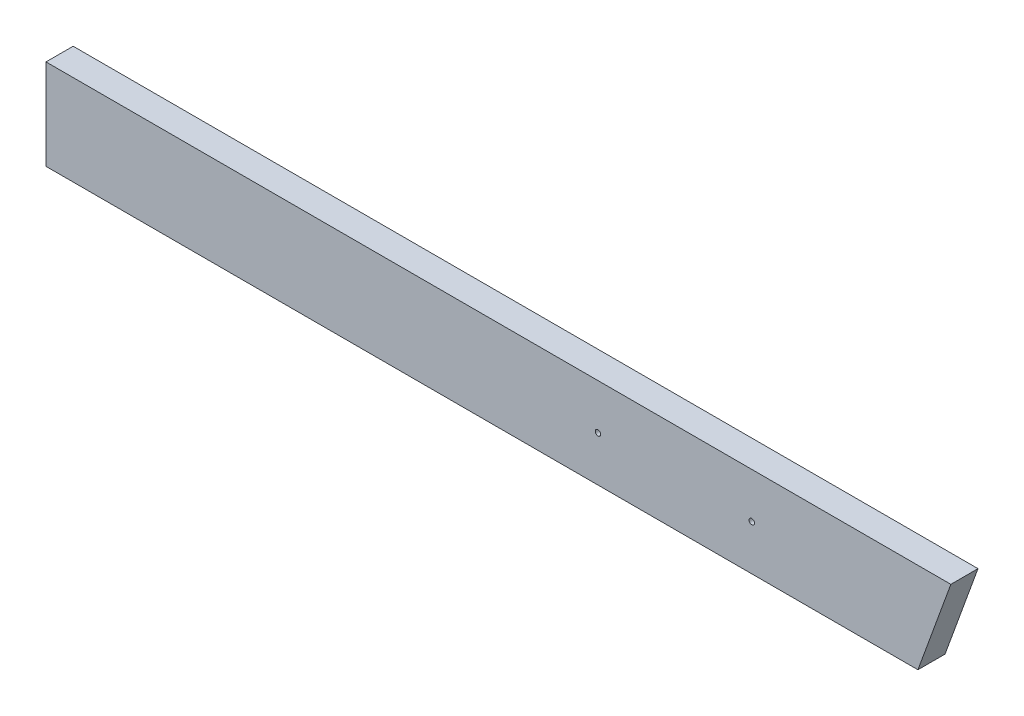
ISO-10303-21;
HEADER;
FILE_DESCRIPTION(('STEP AP214'),'2;1');
FILE_NAME('part.step','',(''),(''),'','','');
FILE_SCHEMA(('AUTOMOTIVE_DESIGN { 1 0 10303 214 1 1 1 1 }'));
ENDSEC;
DATA;
#1=APPLICATION_CONTEXT('core data for automotive mechanical design processes');
#2=APPLICATION_PROTOCOL_DEFINITION('international standard','automotive_design',2000,#1);
#3=PRODUCT_CONTEXT('',#1,'mechanical');
#4=PRODUCT('Part','Part','',(#3));
#5=PRODUCT_RELATED_PRODUCT_CATEGORY('part','',(#4));
#6=PRODUCT_DEFINITION_FORMATION('','',#4);
#7=PRODUCT_DEFINITION_CONTEXT('part definition',#1,'design');
#8=PRODUCT_DEFINITION('design','',#6,#7);
#9=PRODUCT_DEFINITION_SHAPE('','',#8);
#10=(LENGTH_UNIT() NAMED_UNIT(*) SI_UNIT(.MILLI.,.METRE.));
#11=(NAMED_UNIT(*) PLANE_ANGLE_UNIT() SI_UNIT($,.RADIAN.));
#12=(NAMED_UNIT(*) SI_UNIT($,.STERADIAN.) SOLID_ANGLE_UNIT());
#13=UNCERTAINTY_MEASURE_WITH_UNIT(LENGTH_MEASURE(1.E-05),#10,'distance_accuracy_value','');
#14=(GEOMETRIC_REPRESENTATION_CONTEXT(3) GLOBAL_UNCERTAINTY_ASSIGNED_CONTEXT((#13)) GLOBAL_UNIT_ASSIGNED_CONTEXT((#10,
#11,#12)) REPRESENTATION_CONTEXT('',''));
#15=CARTESIAN_POINT('',(0.,0.,0.));
#16=DIRECTION('',(0.,0.,1.));
#17=DIRECTION('',(1.,0.,0.));
#18=AXIS2_PLACEMENT_3D('',#15,#16,#17);
#19=CARTESIAN_POINT('',(-500.,50.,30.));
#20=DIRECTION('',(1.,0.,0.));
#21=DIRECTION('',(0.,0.,-1.));
#22=AXIS2_PLACEMENT_3D('',#19,#20,#21);
#23=PLANE('',#22);
#24=DIRECTION('',(0.,-1.,0.));
#25=VECTOR('',#24,1.);
#26=CARTESIAN_POINT('',(-500.,50.,0.));
#27=LINE('',#26,#25);
#28=CARTESIAN_POINT('',(-500.,50.,0.));
#29=VERTEX_POINT('',#28);
#30=CARTESIAN_POINT('',(-500.,-50.,0.));
#31=VERTEX_POINT('',#30);
#32=EDGE_CURVE('E107',#29,#31,#27,.T.);
#33=ORIENTED_EDGE('',*,*,#32,.T.);
#34=DIRECTION('',(0.,0.,-1.));
#35=VECTOR('',#34,1.);
#36=CARTESIAN_POINT('',(-500.,-50.,30.));
#37=LINE('',#36,#35);
#38=CARTESIAN_POINT('',(-500.,-50.,30.));
#39=VERTEX_POINT('',#38);
#40=EDGE_CURVE('E11',#39,#31,#37,.T.);
#41=ORIENTED_EDGE('',*,*,#40,.F.);
#42=DIRECTION('',(0.,-1.,0.));
#43=VECTOR('',#42,1.);
#44=CARTESIAN_POINT('',(-500.,50.,30.));
#45=LINE('',#44,#43);
#46=CARTESIAN_POINT('',(-500.,50.,30.));
#47=VERTEX_POINT('',#46);
#48=EDGE_CURVE('E91',#47,#39,#45,.T.);
#49=ORIENTED_EDGE('',*,*,#48,.F.);
#50=DIRECTION('',(0.,0.,-1.));
#51=VECTOR('',#50,1.);
#52=CARTESIAN_POINT('',(-500.,50.,30.));
#53=LINE('',#52,#51);
#54=EDGE_CURVE('E103',#47,#29,#53,.T.);
#55=ORIENTED_EDGE('',*,*,#54,.T.);
#56=EDGE_LOOP('',(#33,#41,#49,#55));
#57=FACE_BOUND('',#56,.T.);
#58=ADVANCED_FACE('F39',(#57),#23,.F.);
#59=CARTESIAN_POINT('',(463.60297657338,-50.,30.));
#60=DIRECTION('',(0.,1.,0.));
#61=DIRECTION('',(-1.,0.,0.));
#62=AXIS2_PLACEMENT_3D('',#59,#60,#61);
#63=PLANE('',#62);
#64=DIRECTION('',(1.,0.,0.));
#65=VECTOR('',#64,1.);
#66=CARTESIAN_POINT('',(463.60297657338,-50.,0.));
#67=LINE('',#66,#65);
#68=CARTESIAN_POINT('',(463.60297657338,-50.,0.));
#69=VERTEX_POINT('',#68);
#70=EDGE_CURVE('E96',#31,#69,#67,.T.);
#71=ORIENTED_EDGE('',*,*,#70,.T.);
#72=DIRECTION('',(0.,0.,-1.));
#73=VECTOR('',#72,1.);
#74=CARTESIAN_POINT('',(463.60297657338,-50.,30.));
#75=LINE('',#74,#73);
#76=CARTESIAN_POINT('',(463.60297657338,-50.,30.));
#77=VERTEX_POINT('',#76);
#78=EDGE_CURVE('E48',#77,#69,#75,.T.);
#79=ORIENTED_EDGE('',*,*,#78,.F.);
#80=DIRECTION('',(1.,0.,0.));
#81=VECTOR('',#80,1.);
#82=CARTESIAN_POINT('',(463.60297657338,-50.,30.));
#83=LINE('',#82,#81);
#84=EDGE_CURVE('E86',#39,#77,#83,.T.);
#85=ORIENTED_EDGE('',*,*,#84,.F.);
#86=ORIENTED_EDGE('',*,*,#40,.T.);
#87=EDGE_LOOP('',(#71,#79,#85,#86));
#88=FACE_BOUND('',#87,.T.);
#89=ADVANCED_FACE('F95',(#88),#63,.F.);
#90=CARTESIAN_POINT('',(500.,50.,30.));
#91=DIRECTION('',(-0.939692620785907,0.342020143325673,0.));
#92=DIRECTION('',(-0.342020143325673,-0.939692620785907,0.));
#93=AXIS2_PLACEMENT_3D('',#90,#91,#92);
#94=PLANE('',#93);
#95=DIRECTION('',(0.342020143325673,0.939692620785907,0.));
#96=VECTOR('',#95,1.);
#97=CARTESIAN_POINT('',(500.,50.,0.));
#98=LINE('',#97,#96);
#99=CARTESIAN_POINT('',(500.,50.,0.));
#100=VERTEX_POINT('',#99);
#101=EDGE_CURVE('E73',#69,#100,#98,.T.);
#102=ORIENTED_EDGE('',*,*,#101,.T.);
#103=DIRECTION('',(0.,0.,-1.));
#104=VECTOR('',#103,1.);
#105=CARTESIAN_POINT('',(500.,50.,30.));
#106=LINE('',#105,#104);
#107=CARTESIAN_POINT('',(500.,50.,30.));
#108=VERTEX_POINT('',#107);
#109=EDGE_CURVE('E98',#108,#100,#106,.T.);
#110=ORIENTED_EDGE('',*,*,#109,.F.);
#111=DIRECTION('',(0.342020143325673,0.939692620785907,0.));
#112=VECTOR('',#111,1.);
#113=CARTESIAN_POINT('',(500.,50.,30.));
#114=LINE('',#113,#112);
#115=EDGE_CURVE('E89',#77,#108,#114,.T.);
#116=ORIENTED_EDGE('',*,*,#115,.F.);
#117=ORIENTED_EDGE('',*,*,#78,.T.);
#118=EDGE_LOOP('',(#102,#110,#116,#117));
#119=FACE_BOUND('',#118,.T.);
#120=ADVANCED_FACE('F99',(#119),#94,.F.);
#121=CARTESIAN_POINT('',(-500.,50.,30.));
#122=DIRECTION('',(0.,-1.,0.));
#123=DIRECTION('',(0.,0.,-1.));
#124=AXIS2_PLACEMENT_3D('',#121,#122,#123);
#125=PLANE('',#124);
#126=DIRECTION('',(-1.,0.,0.));
#127=VECTOR('',#126,1.);
#128=CARTESIAN_POINT('',(-500.,50.,0.));
#129=LINE('',#128,#127);
#130=EDGE_CURVE('E79',#100,#29,#129,.T.);
#131=ORIENTED_EDGE('',*,*,#130,.T.);
#132=ORIENTED_EDGE('',*,*,#54,.F.);
#133=DIRECTION('',(-1.,0.,0.));
#134=VECTOR('',#133,1.);
#135=CARTESIAN_POINT('',(-500.,50.,30.));
#136=LINE('',#135,#134);
#137=EDGE_CURVE('E56',#108,#47,#136,.T.);
#138=ORIENTED_EDGE('',*,*,#137,.F.);
#139=ORIENTED_EDGE('',*,*,#109,.T.);
#140=EDGE_LOOP('',(#131,#132,#138,#139));
#141=FACE_BOUND('',#140,.T.);
#142=ADVANCED_FACE('F121',(#141),#125,.F.);
#143=CARTESIAN_POINT('',(0.,0.,30.));
#144=DIRECTION('',(0.,0.,-1.));
#145=DIRECTION('',(-1.,0.,0.));
#146=AXIS2_PLACEMENT_3D('',#143,#144,#145);
#147=PLANE('',#146);
#148=CARTESIAN_POINT('',(110.,0.,30.));
#149=DIRECTION('',(0.,0.,1.));
#150=DIRECTION('',(1.,0.,0.));
#151=AXIS2_PLACEMENT_3D('',#148,#149,#150);
#152=CIRCLE('',#151,2.99999999999999);
#153=CARTESIAN_POINT('',(113.,0.,30.));
#154=VERTEX_POINT('',#153);
#155=EDGE_CURVE('E136',#154,#154,#152,.T.);
#156=ORIENTED_EDGE('',*,*,#155,.F.);
#157=EDGE_LOOP('',(#156));
#158=FACE_BOUND('',#157,.T.);
#159=CARTESIAN_POINT('',(280.,0.,30.));
#160=DIRECTION('',(0.,0.,1.));
#161=DIRECTION('',(1.,0.,0.));
#162=AXIS2_PLACEMENT_3D('',#159,#160,#161);
#163=CIRCLE('',#162,2.99999999999999);
#164=CARTESIAN_POINT('',(283.,0.,30.));
#165=VERTEX_POINT('',#164);
#166=EDGE_CURVE('E128',#165,#165,#163,.T.);
#167=ORIENTED_EDGE('',*,*,#166,.F.);
#168=EDGE_LOOP('',(#167));
#169=FACE_BOUND('',#168,.T.);
#170=ORIENTED_EDGE('',*,*,#48,.T.);
#171=ORIENTED_EDGE('',*,*,#84,.T.);
#172=ORIENTED_EDGE('',*,*,#115,.T.);
#173=ORIENTED_EDGE('',*,*,#137,.T.);
#174=EDGE_LOOP('',(#170,#171,#172,#173));
#175=FACE_BOUND('',#174,.T.);
#176=ADVANCED_FACE('F87',(#158,#169,#175),#147,.F.);
#177=CARTESIAN_POINT('',(0.,0.,0.));
#178=DIRECTION('',(0.,0.,-1.));
#179=DIRECTION('',(-1.,0.,0.));
#180=AXIS2_PLACEMENT_3D('',#177,#178,#179);
#181=PLANE('',#180);
#182=CARTESIAN_POINT('',(110.,0.,0.));
#183=DIRECTION('',(0.,0.,1.));
#184=DIRECTION('',(1.,0.,0.));
#185=AXIS2_PLACEMENT_3D('',#182,#183,#184);
#186=CIRCLE('',#185,2.99999999999999);
#187=CARTESIAN_POINT('',(113.,0.,0.));
#188=VERTEX_POINT('',#187);
#189=EDGE_CURVE('E111',#188,#188,#186,.T.);
#190=ORIENTED_EDGE('',*,*,#189,.T.);
#191=EDGE_LOOP('',(#190));
#192=FACE_BOUND('',#191,.T.);
#193=CARTESIAN_POINT('',(280.,0.,0.));
#194=DIRECTION('',(0.,0.,1.));
#195=DIRECTION('',(1.,0.,0.));
#196=AXIS2_PLACEMENT_3D('',#193,#194,#195);
#197=CIRCLE('',#196,2.99999999999999);
#198=CARTESIAN_POINT('',(283.,0.,0.));
#199=VERTEX_POINT('',#198);
#200=EDGE_CURVE('E132',#199,#199,#197,.T.);
#201=ORIENTED_EDGE('',*,*,#200,.T.);
#202=EDGE_LOOP('',(#201));
#203=FACE_BOUND('',#202,.T.);
#204=ORIENTED_EDGE('',*,*,#32,.F.);
#205=ORIENTED_EDGE('',*,*,#130,.F.);
#206=ORIENTED_EDGE('',*,*,#101,.F.);
#207=ORIENTED_EDGE('',*,*,#70,.F.);
#208=EDGE_LOOP('',(#204,#205,#206,#207));
#209=FACE_BOUND('',#208,.T.);
#210=ADVANCED_FACE('F124',(#192,#203,#209),#181,.T.);
#211=CARTESIAN_POINT('',(280.,0.,0.));
#212=DIRECTION('',(0.,0.,1.));
#213=DIRECTION('',(1.,0.,0.));
#214=AXIS2_PLACEMENT_3D('',#211,#212,#213);
#215=CYLINDRICAL_SURFACE('',#214,2.99999999999999);
#216=ORIENTED_EDGE('',*,*,#200,.F.);
#217=EDGE_LOOP('',(#216));
#218=FACE_BOUND('',#217,.T.);
#219=ORIENTED_EDGE('',*,*,#166,.T.);
#220=EDGE_LOOP('',(#219));
#221=FACE_BOUND('',#220,.T.);
#222=ADVANCED_FACE('F149',(#218,#221),#215,.F.);
#223=CARTESIAN_POINT('',(110.,0.,0.));
#224=DIRECTION('',(0.,0.,1.));
#225=DIRECTION('',(1.,0.,0.));
#226=AXIS2_PLACEMENT_3D('',#223,#224,#225);
#227=CYLINDRICAL_SURFACE('',#226,2.99999999999999);
#228=ORIENTED_EDGE('',*,*,#189,.F.);
#229=EDGE_LOOP('',(#228));
#230=FACE_BOUND('',#229,.T.);
#231=ORIENTED_EDGE('',*,*,#155,.T.);
#232=EDGE_LOOP('',(#231));
#233=FACE_BOUND('',#232,.T.);
#234=ADVANCED_FACE('F146',(#230,#233),#227,.F.);
#235=CLOSED_SHELL('',(#58,#89,#120,#142,#176,#210,#222,#234));
#236=MANIFOLD_SOLID_BREP('B2',#235);
#237=ADVANCED_BREP_SHAPE_REPRESENTATION('',(#18,#236),#14);
#238=SHAPE_DEFINITION_REPRESENTATION(#9,#237);
ENDSEC;
END-ISO-10303-21;
